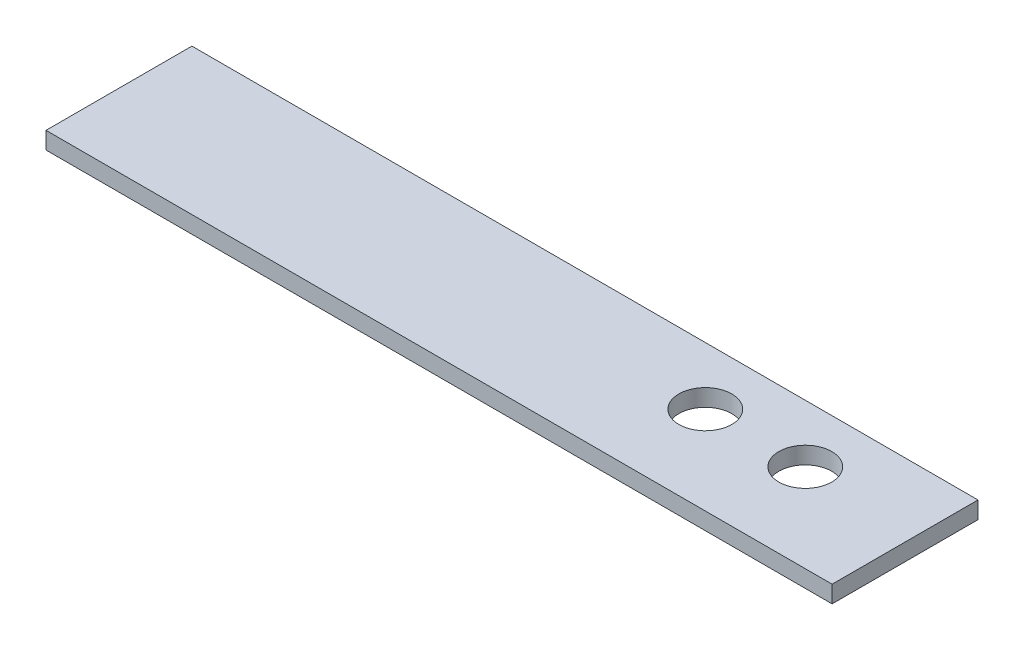
ISO-10303-21;
HEADER;
FILE_DESCRIPTION(('STEP AP214'),'2;1');
FILE_NAME('part.step','',(''),(''),'','','');
FILE_SCHEMA(('AUTOMOTIVE_DESIGN { 1 0 10303 214 1 1 1 1 }'));
ENDSEC;
DATA;
#1=APPLICATION_CONTEXT('core data for automotive mechanical design processes');
#2=APPLICATION_PROTOCOL_DEFINITION('international standard','automotive_design',2000,#1);
#3=PRODUCT_CONTEXT('',#1,'mechanical');
#4=PRODUCT('Part','Part','',(#3));
#5=PRODUCT_RELATED_PRODUCT_CATEGORY('part','',(#4));
#6=PRODUCT_DEFINITION_FORMATION('','',#4);
#7=PRODUCT_DEFINITION_CONTEXT('part definition',#1,'design');
#8=PRODUCT_DEFINITION('design','',#6,#7);
#9=PRODUCT_DEFINITION_SHAPE('','',#8);
#10=(LENGTH_UNIT() NAMED_UNIT(*) SI_UNIT(.MILLI.,.METRE.));
#11=(NAMED_UNIT(*) PLANE_ANGLE_UNIT() SI_UNIT($,.RADIAN.));
#12=(NAMED_UNIT(*) SI_UNIT($,.STERADIAN.) SOLID_ANGLE_UNIT());
#13=UNCERTAINTY_MEASURE_WITH_UNIT(LENGTH_MEASURE(1.E-05),#10,'distance_accuracy_value','');
#14=(GEOMETRIC_REPRESENTATION_CONTEXT(3) GLOBAL_UNCERTAINTY_ASSIGNED_CONTEXT((#13)) GLOBAL_UNIT_ASSIGNED_CONTEXT((#10,
#11,#12)) REPRESENTATION_CONTEXT('',''));
#15=CARTESIAN_POINT('',(0.,0.,0.));
#16=DIRECTION('',(0.,0.,1.));
#17=DIRECTION('',(1.,0.,0.));
#18=AXIS2_PLACEMENT_3D('',#15,#16,#17);
#19=CARTESIAN_POINT('',(-62.800543040071,19.05,15.8181818935517));
#20=DIRECTION('',(0.,0.,-1.));
#21=DIRECTION('',(-1.,0.,0.));
#22=AXIS2_PLACEMENT_3D('',#19,#20,#21);
#23=PLANE('',#22);
#24=DIRECTION('',(1.,0.,0.));
#25=VECTOR('',#24,1.);
#26=CARTESIAN_POINT('',(-62.800543040071,0.,15.8181818935517));
#27=LINE('',#26,#25);
#28=CARTESIAN_POINT('',(-62.800543040071,0.,15.8181818935517));
#29=VERTEX_POINT('',#28);
#30=CARTESIAN_POINT('',(813.499456959929,0.,15.8181818935517));
#31=VERTEX_POINT('',#30);
#32=EDGE_CURVE('E106',#29,#31,#27,.T.);
#33=ORIENTED_EDGE('',*,*,#32,.T.);
#34=DIRECTION('',(0.,-1.,0.));
#35=VECTOR('',#34,1.);
#36=CARTESIAN_POINT('',(813.499456959929,19.05,15.8181818935517));
#37=LINE('',#36,#35);
#38=CARTESIAN_POINT('',(813.499456959929,19.05,15.8181818935517));
#39=VERTEX_POINT('',#38);
#40=EDGE_CURVE('E11',#39,#31,#37,.T.);
#41=ORIENTED_EDGE('',*,*,#40,.F.);
#42=DIRECTION('',(1.,0.,0.));
#43=VECTOR('',#42,1.);
#44=CARTESIAN_POINT('',(-62.800543040071,19.05,15.8181818935517));
#45=LINE('',#44,#43);
#46=CARTESIAN_POINT('',(-62.800543040071,19.05,15.8181818935517));
#47=VERTEX_POINT('',#46);
#48=EDGE_CURVE('E79',#47,#39,#45,.T.);
#49=ORIENTED_EDGE('',*,*,#48,.F.);
#50=DIRECTION('',(0.,-1.,0.));
#51=VECTOR('',#50,1.);
#52=CARTESIAN_POINT('',(-62.800543040071,19.05,15.8181818935517));
#53=LINE('',#52,#51);
#54=EDGE_CURVE('E102',#47,#29,#53,.T.);
#55=ORIENTED_EDGE('',*,*,#54,.T.);
#56=EDGE_LOOP('',(#33,#41,#49,#55));
#57=FACE_BOUND('',#56,.T.);
#58=ADVANCED_FACE('F39',(#57),#23,.F.);
#59=CARTESIAN_POINT('',(813.499456959929,19.05,-146.821173802448));
#60=DIRECTION('',(1.,0.,0.));
#61=DIRECTION('',(0.,0.,-1.));
#62=AXIS2_PLACEMENT_3D('',#59,#60,#61);
#63=PLANE('',#62);
#64=DIRECTION('',(0.,0.,1.));
#65=VECTOR('',#64,1.);
#66=CARTESIAN_POINT('',(813.499456959929,0.,-146.821173802448));
#67=LINE('',#66,#65);
#68=CARTESIAN_POINT('',(813.499456959929,0.,-146.821173802448));
#69=VERTEX_POINT('',#68);
#70=EDGE_CURVE('E88',#69,#31,#67,.T.);
#71=ORIENTED_EDGE('',*,*,#70,.F.);
#72=DIRECTION('',(0.,-1.,0.));
#73=VECTOR('',#72,1.);
#74=CARTESIAN_POINT('',(813.499456959929,19.05,-146.821173802448));
#75=LINE('',#74,#73);
#76=CARTESIAN_POINT('',(813.499456959929,19.05,-146.821173802448));
#77=VERTEX_POINT('',#76);
#78=EDGE_CURVE('E48',#77,#69,#75,.T.);
#79=ORIENTED_EDGE('',*,*,#78,.F.);
#80=DIRECTION('',(0.,0.,1.));
#81=VECTOR('',#80,1.);
#82=CARTESIAN_POINT('',(813.499456959929,19.05,-146.821173802448));
#83=LINE('',#82,#81);
#84=EDGE_CURVE('E86',#77,#39,#83,.T.);
#85=ORIENTED_EDGE('',*,*,#84,.T.);
#86=ORIENTED_EDGE('',*,*,#40,.T.);
#87=EDGE_LOOP('',(#71,#79,#85,#86));
#88=FACE_BOUND('',#87,.T.);
#89=ADVANCED_FACE('F85',(#88),#63,.T.);
#90=CARTESIAN_POINT('',(-62.800543040071,19.05,-146.821173802448));
#91=DIRECTION('',(0.,0.,-1.));
#92=DIRECTION('',(-1.,0.,0.));
#93=AXIS2_PLACEMENT_3D('',#90,#91,#92);
#94=PLANE('',#93);
#95=DIRECTION('',(1.,0.,0.));
#96=VECTOR('',#95,1.);
#97=CARTESIAN_POINT('',(-62.800543040071,0.,-146.821173802448));
#98=LINE('',#97,#96);
#99=CARTESIAN_POINT('',(-62.800543040071,0.,-146.821173802448));
#100=VERTEX_POINT('',#99);
#101=EDGE_CURVE('E113',#100,#69,#98,.T.);
#102=ORIENTED_EDGE('',*,*,#101,.F.);
#103=DIRECTION('',(0.,-1.,0.));
#104=VECTOR('',#103,1.);
#105=CARTESIAN_POINT('',(-62.800543040071,19.05,-146.821173802448));
#106=LINE('',#105,#104);
#107=CARTESIAN_POINT('',(-62.800543040071,19.05,-146.821173802448));
#108=VERTEX_POINT('',#107);
#109=EDGE_CURVE('E71',#108,#100,#106,.T.);
#110=ORIENTED_EDGE('',*,*,#109,.F.);
#111=DIRECTION('',(1.,0.,0.));
#112=VECTOR('',#111,1.);
#113=CARTESIAN_POINT('',(-62.800543040071,19.05,-146.821173802448));
#114=LINE('',#113,#112);
#115=EDGE_CURVE('E95',#108,#77,#114,.T.);
#116=ORIENTED_EDGE('',*,*,#115,.T.);
#117=ORIENTED_EDGE('',*,*,#78,.T.);
#118=EDGE_LOOP('',(#102,#110,#116,#117));
#119=FACE_BOUND('',#118,.T.);
#120=ADVANCED_FACE('F98',(#119),#94,.T.);
#121=CARTESIAN_POINT('',(-62.800543040071,19.05,-146.821173802448));
#122=DIRECTION('',(1.,0.,0.));
#123=DIRECTION('',(0.,0.,-1.));
#124=AXIS2_PLACEMENT_3D('',#121,#122,#123);
#125=PLANE('',#124);
#126=DIRECTION('',(0.,0.,1.));
#127=VECTOR('',#126,1.);
#128=CARTESIAN_POINT('',(-62.800543040071,0.,-146.821173802448));
#129=LINE('',#128,#127);
#130=EDGE_CURVE('E74',#100,#29,#129,.T.);
#131=ORIENTED_EDGE('',*,*,#130,.T.);
#132=ORIENTED_EDGE('',*,*,#54,.F.);
#133=DIRECTION('',(0.,0.,1.));
#134=VECTOR('',#133,1.);
#135=CARTESIAN_POINT('',(-62.800543040071,19.05,-146.821173802448));
#136=LINE('',#135,#134);
#137=EDGE_CURVE('E56',#108,#47,#136,.T.);
#138=ORIENTED_EDGE('',*,*,#137,.F.);
#139=ORIENTED_EDGE('',*,*,#109,.T.);
#140=EDGE_LOOP('',(#131,#132,#138,#139));
#141=FACE_BOUND('',#140,.T.);
#142=ADVANCED_FACE('F136',(#141),#125,.F.);
#143=CARTESIAN_POINT('',(0.,19.05,0.));
#144=DIRECTION('',(0.,-1.,0.));
#145=DIRECTION('',(0.,0.,-1.));
#146=AXIS2_PLACEMENT_3D('',#143,#144,#145);
#147=PLANE('',#146);
#148=CARTESIAN_POINT('',(685.24027425031,19.05,-82.5679467617447));
#149=DIRECTION('',(0.,1.,0.));
#150=DIRECTION('',(0.,0.,1.));
#151=AXIS2_PLACEMENT_3D('',#148,#149,#150);
#152=CIRCLE('',#151,29.499999928);
#153=CARTESIAN_POINT('',(685.24027425031,19.05,-53.0679468337446));
#154=VERTEX_POINT('',#153);
#155=EDGE_CURVE('E187',#154,#154,#152,.T.);
#156=ORIENTED_EDGE('',*,*,#155,.F.);
#157=EDGE_LOOP('',(#156));
#158=FACE_BOUND('',#157,.T.);
#159=CARTESIAN_POINT('',(573.905935057533,19.05,-82.4588113000032));
#160=DIRECTION('',(0.,1.,0.));
#161=DIRECTION('',(0.,0.,1.));
#162=AXIS2_PLACEMENT_3D('',#159,#160,#161);
#163=CIRCLE('',#162,29.4999999279999);
#164=CARTESIAN_POINT('',(573.905935057533,19.05,-52.9588113720032));
#165=VERTEX_POINT('',#164);
#166=EDGE_CURVE('E191',#165,#165,#163,.T.);
#167=ORIENTED_EDGE('',*,*,#166,.F.);
#168=EDGE_LOOP('',(#167));
#169=FACE_BOUND('',#168,.T.);
#170=ORIENTED_EDGE('',*,*,#48,.T.);
#171=ORIENTED_EDGE('',*,*,#84,.F.);
#172=ORIENTED_EDGE('',*,*,#115,.F.);
#173=ORIENTED_EDGE('',*,*,#137,.T.);
#174=EDGE_LOOP('',(#170,#171,#172,#173));
#175=FACE_BOUND('',#174,.T.);
#176=ADVANCED_FACE('F94',(#158,#169,#175),#147,.F.);
#177=CARTESIAN_POINT('',(0.,0.,0.));
#178=DIRECTION('',(0.,-1.,0.));
#179=DIRECTION('',(0.,0.,-1.));
#180=AXIS2_PLACEMENT_3D('',#177,#178,#179);
#181=PLANE('',#180);
#182=CARTESIAN_POINT('',(685.24027425031,0.,-82.5679467617447));
#183=DIRECTION('',(0.,1.,0.));
#184=DIRECTION('',(0.,0.,1.));
#185=AXIS2_PLACEMENT_3D('',#182,#183,#184);
#186=CIRCLE('',#185,29.499999928);
#187=CARTESIAN_POINT('',(685.24027425031,0.,-53.0679468337446));
#188=VERTEX_POINT('',#187);
#189=EDGE_CURVE('E184',#188,#188,#186,.T.);
#190=ORIENTED_EDGE('',*,*,#189,.T.);
#191=EDGE_LOOP('',(#190));
#192=FACE_BOUND('',#191,.T.);
#193=CARTESIAN_POINT('',(573.905935057533,0.,-82.4588113000032));
#194=DIRECTION('',(0.,1.,0.));
#195=DIRECTION('',(0.,0.,1.));
#196=AXIS2_PLACEMENT_3D('',#193,#194,#195);
#197=CIRCLE('',#196,29.4999999279999);
#198=CARTESIAN_POINT('',(573.905935057533,0.,-52.9588113720032));
#199=VERTEX_POINT('',#198);
#200=EDGE_CURVE('E110',#199,#199,#197,.T.);
#201=ORIENTED_EDGE('',*,*,#200,.T.);
#202=EDGE_LOOP('',(#201));
#203=FACE_BOUND('',#202,.T.);
#204=ORIENTED_EDGE('',*,*,#32,.F.);
#205=ORIENTED_EDGE('',*,*,#130,.F.);
#206=ORIENTED_EDGE('',*,*,#101,.T.);
#207=ORIENTED_EDGE('',*,*,#70,.T.);
#208=EDGE_LOOP('',(#204,#205,#206,#207));
#209=FACE_BOUND('',#208,.T.);
#210=ADVANCED_FACE('F124',(#192,#203,#209),#181,.T.);
#211=CARTESIAN_POINT('',(573.905935057533,0.,-82.4588113000032));
#212=DIRECTION('',(0.,1.,0.));
#213=DIRECTION('',(0.,0.,1.));
#214=AXIS2_PLACEMENT_3D('',#211,#212,#213);
#215=CYLINDRICAL_SURFACE('',#214,29.4999999279999);
#216=CARTESIAN_POINT('',(573.905935057533,0.,-52.9588113720032));
#217=CARTESIAN_POINT('',(573.905935057533,0.1984375,-52.9588113720032));
#218=CARTESIAN_POINT('',(573.905935057533,0.396875,-52.9588113720032));
#219=CARTESIAN_POINT('',(573.905935057533,0.79375,-52.9588113720032));
#220=CARTESIAN_POINT('',(573.905935057533,0.9921875,-52.9588113720032));
#221=CARTESIAN_POINT('',(573.905935057533,1.3890625,-52.9588113720032));
#222=CARTESIAN_POINT('',(573.905935057533,1.5875,-52.9588113720032));
#223=CARTESIAN_POINT('',(573.905935057533,1.984375,-52.9588113720032));
#224=CARTESIAN_POINT('',(573.905935057533,2.1828125,-52.9588113720032));
#225=CARTESIAN_POINT('',(573.905935057533,2.5796875,-52.9588113720032));
#226=CARTESIAN_POINT('',(573.905935057533,2.778125,-52.9588113720032));
#227=CARTESIAN_POINT('',(573.905935057533,3.175,-52.9588113720032));
#228=CARTESIAN_POINT('',(573.905935057533,3.3734375,-52.9588113720032));
#229=CARTESIAN_POINT('',(573.905935057533,3.7703125,-52.9588113720032));
#230=CARTESIAN_POINT('',(573.905935057533,3.96875,-52.9588113720032));
#231=CARTESIAN_POINT('',(573.905935057533,4.365625,-52.9588113720032));
#232=CARTESIAN_POINT('',(573.905935057533,4.5640625,-52.9588113720032));
#233=CARTESIAN_POINT('',(573.905935057533,4.9609375,-52.9588113720032));
#234=CARTESIAN_POINT('',(573.905935057533,5.159375,-52.9588113720032));
#235=CARTESIAN_POINT('',(573.905935057533,5.55625,-52.9588113720032));
#236=CARTESIAN_POINT('',(573.905935057533,5.7546875,-52.9588113720032));
#237=CARTESIAN_POINT('',(573.905935057533,6.1515625,-52.9588113720032));
#238=CARTESIAN_POINT('',(573.905935057533,6.35,-52.9588113720032));
#239=CARTESIAN_POINT('',(573.905935057533,6.746875,-52.9588113720032));
#240=CARTESIAN_POINT('',(573.905935057533,6.9453125,-52.9588113720032));
#241=CARTESIAN_POINT('',(573.905935057533,7.3421875,-52.9588113720032));
#242=CARTESIAN_POINT('',(573.905935057533,7.540625,-52.9588113720032));
#243=CARTESIAN_POINT('',(573.905935057533,7.9375,-52.9588113720032));
#244=CARTESIAN_POINT('',(573.905935057533,8.1359375,-52.9588113720032));
#245=CARTESIAN_POINT('',(573.905935057533,8.5328125,-52.9588113720032));
#246=CARTESIAN_POINT('',(573.905935057533,8.73125,-52.9588113720032));
#247=CARTESIAN_POINT('',(573.905935057533,9.128125,-52.9588113720032));
#248=CARTESIAN_POINT('',(573.905935057533,9.3265625,-52.9588113720032));
#249=CARTESIAN_POINT('',(573.905935057533,9.7234375,-52.9588113720032));
#250=CARTESIAN_POINT('',(573.905935057533,9.921875,-52.9588113720032));
#251=CARTESIAN_POINT('',(573.905935057533,10.31875,-52.9588113720032));
#252=CARTESIAN_POINT('',(573.905935057533,10.5171875,-52.9588113720032));
#253=CARTESIAN_POINT('',(573.905935057533,10.9140625,-52.9588113720032));
#254=CARTESIAN_POINT('',(573.905935057533,11.1125,-52.9588113720032));
#255=CARTESIAN_POINT('',(573.905935057533,11.509375,-52.9588113720032));
#256=CARTESIAN_POINT('',(573.905935057533,11.7078125,-52.9588113720032));
#257=CARTESIAN_POINT('',(573.905935057533,12.1046875,-52.9588113720032));
#258=CARTESIAN_POINT('',(573.905935057533,12.303125,-52.9588113720032));
#259=CARTESIAN_POINT('',(573.905935057533,12.7,-52.9588113720032));
#260=CARTESIAN_POINT('',(573.905935057533,12.8984375,-52.9588113720032));
#261=CARTESIAN_POINT('',(573.905935057533,13.2953125,-52.9588113720032));
#262=CARTESIAN_POINT('',(573.905935057533,13.49375,-52.9588113720032));
#263=CARTESIAN_POINT('',(573.905935057533,13.890625,-52.9588113720032));
#264=CARTESIAN_POINT('',(573.905935057533,14.0890625,-52.9588113720032));
#265=CARTESIAN_POINT('',(573.905935057533,14.4859375,-52.9588113720032));
#266=CARTESIAN_POINT('',(573.905935057533,14.684375,-52.9588113720032));
#267=CARTESIAN_POINT('',(573.905935057533,15.08125,-52.9588113720032));
#268=CARTESIAN_POINT('',(573.905935057533,15.2796875,-52.9588113720032));
#269=CARTESIAN_POINT('',(573.905935057533,15.6765625,-52.9588113720032));
#270=CARTESIAN_POINT('',(573.905935057533,15.875,-52.9588113720032));
#271=CARTESIAN_POINT('',(573.905935057533,16.271875,-52.9588113720032));
#272=CARTESIAN_POINT('',(573.905935057533,16.4703125,-52.9588113720032));
#273=CARTESIAN_POINT('',(573.905935057533,16.8671875,-52.9588113720032));
#274=CARTESIAN_POINT('',(573.905935057533,17.065625,-52.9588113720032));
#275=CARTESIAN_POINT('',(573.905935057533,17.4625,-52.9588113720032));
#276=CARTESIAN_POINT('',(573.905935057533,17.6609375,-52.9588113720032));
#277=CARTESIAN_POINT('',(573.905935057533,18.0578125,-52.9588113720032));
#278=CARTESIAN_POINT('',(573.905935057533,18.25625,-52.9588113720032));
#279=CARTESIAN_POINT('',(573.905935057533,18.653125,-52.9588113720032));
#280=CARTESIAN_POINT('',(573.905935057533,18.8515625,-52.9588113720032));
#281=CARTESIAN_POINT('',(573.905935057533,19.05,-52.9588113720032));
#282=B_SPLINE_CURVE_WITH_KNOTS('',3,(#216,#217,#218,#219,#220,#221,#222,#223,#224,#225,#226,
#227,#228,#229,#230,#231,#232,#233,#234,#235,#236,#237,#238,#239,#240,#241,#242,#243,#244,#245,
#246,#247,#248,#249,#250,#251,#252,#253,#254,#255,#256,#257,#258,#259,#260,#261,#262,#263,#264,
#265,#266,#267,#268,#269,#270,#271,#272,#273,#274,#275,#276,#277,#278,#279,#280,#281),
.UNSPECIFIED.,.F.,.F.,(4,2,2,2,2,2,2,2,2,2,2,2,2,2,2,2,2,2,2,2,2,2,2,2,2,2,2,2,2,2,2,2,4),(0.,
0.5953125,1.190625,1.7859375,2.38125,2.9765625,3.571875,4.1671875,4.7625,5.3578125,5.953125,
6.5484375,7.14375,7.7390625,8.334375,8.9296875,9.525,10.1203125,10.715625,11.3109375,11.90625,
12.5015625,13.096875,13.6921875,14.2875,14.8828125,15.478125,16.0734375,16.66875,17.2640625,
17.859375,18.4546875,19.05),.UNSPECIFIED.);
#283=EDGE_CURVE('BSEAM126',#199,#165,#282,.T.);
#284=ORIENTED_EDGE('',*,*,#200,.F.);
#285=ORIENTED_EDGE('',*,*,#166,.T.);
#286=ORIENTED_EDGE('',*,*,#283,.T.);
#287=ORIENTED_EDGE('',*,*,#283,.F.);
#288=EDGE_LOOP('',(#284,#286,#285,#287));
#289=FACE_BOUND('',#288,.T.);
#290=ADVANCED_FACE('F126',(#289),#215,.F.);
#291=CARTESIAN_POINT('',(685.24027425031,0.,-82.5679467617447));
#292=DIRECTION('',(0.,1.,0.));
#293=DIRECTION('',(0.,0.,1.));
#294=AXIS2_PLACEMENT_3D('',#291,#292,#293);
#295=CYLINDRICAL_SURFACE('',#294,29.499999928);
#296=CARTESIAN_POINT('',(685.24027425031,0.,-53.0679468337446));
#297=CARTESIAN_POINT('',(685.24027425031,0.1984375,-53.0679468337446));
#298=CARTESIAN_POINT('',(685.24027425031,0.396875,-53.0679468337446));
#299=CARTESIAN_POINT('',(685.24027425031,0.79375,-53.0679468337446));
#300=CARTESIAN_POINT('',(685.24027425031,0.9921875,-53.0679468337446));
#301=CARTESIAN_POINT('',(685.24027425031,1.3890625,-53.0679468337446));
#302=CARTESIAN_POINT('',(685.24027425031,1.5875,-53.0679468337446));
#303=CARTESIAN_POINT('',(685.24027425031,1.984375,-53.0679468337446));
#304=CARTESIAN_POINT('',(685.24027425031,2.1828125,-53.0679468337446));
#305=CARTESIAN_POINT('',(685.24027425031,2.5796875,-53.0679468337446));
#306=CARTESIAN_POINT('',(685.24027425031,2.778125,-53.0679468337446));
#307=CARTESIAN_POINT('',(685.24027425031,3.175,-53.0679468337446));
#308=CARTESIAN_POINT('',(685.24027425031,3.3734375,-53.0679468337446));
#309=CARTESIAN_POINT('',(685.24027425031,3.7703125,-53.0679468337446));
#310=CARTESIAN_POINT('',(685.24027425031,3.96875,-53.0679468337446));
#311=CARTESIAN_POINT('',(685.24027425031,4.365625,-53.0679468337446));
#312=CARTESIAN_POINT('',(685.24027425031,4.5640625,-53.0679468337446));
#313=CARTESIAN_POINT('',(685.24027425031,4.9609375,-53.0679468337446));
#314=CARTESIAN_POINT('',(685.24027425031,5.159375,-53.0679468337446));
#315=CARTESIAN_POINT('',(685.24027425031,5.55625,-53.0679468337446));
#316=CARTESIAN_POINT('',(685.24027425031,5.7546875,-53.0679468337446));
#317=CARTESIAN_POINT('',(685.24027425031,6.1515625,-53.0679468337446));
#318=CARTESIAN_POINT('',(685.24027425031,6.35,-53.0679468337446));
#319=CARTESIAN_POINT('',(685.24027425031,6.746875,-53.0679468337446));
#320=CARTESIAN_POINT('',(685.24027425031,6.9453125,-53.0679468337446));
#321=CARTESIAN_POINT('',(685.24027425031,7.3421875,-53.0679468337446));
#322=CARTESIAN_POINT('',(685.24027425031,7.540625,-53.0679468337446));
#323=CARTESIAN_POINT('',(685.24027425031,7.9375,-53.0679468337446));
#324=CARTESIAN_POINT('',(685.24027425031,8.1359375,-53.0679468337446));
#325=CARTESIAN_POINT('',(685.24027425031,8.5328125,-53.0679468337446));
#326=CARTESIAN_POINT('',(685.24027425031,8.73125,-53.0679468337446));
#327=CARTESIAN_POINT('',(685.24027425031,9.128125,-53.0679468337446));
#328=CARTESIAN_POINT('',(685.24027425031,9.3265625,-53.0679468337446));
#329=CARTESIAN_POINT('',(685.24027425031,9.7234375,-53.0679468337446));
#330=CARTESIAN_POINT('',(685.24027425031,9.921875,-53.0679468337446));
#331=CARTESIAN_POINT('',(685.24027425031,10.31875,-53.0679468337446));
#332=CARTESIAN_POINT('',(685.24027425031,10.5171875,-53.0679468337446));
#333=CARTESIAN_POINT('',(685.24027425031,10.9140625,-53.0679468337446));
#334=CARTESIAN_POINT('',(685.24027425031,11.1125,-53.0679468337446));
#335=CARTESIAN_POINT('',(685.24027425031,11.509375,-53.0679468337446));
#336=CARTESIAN_POINT('',(685.24027425031,11.7078125,-53.0679468337446));
#337=CARTESIAN_POINT('',(685.24027425031,12.1046875,-53.0679468337446));
#338=CARTESIAN_POINT('',(685.24027425031,12.303125,-53.0679468337446));
#339=CARTESIAN_POINT('',(685.24027425031,12.7,-53.0679468337446));
#340=CARTESIAN_POINT('',(685.24027425031,12.8984375,-53.0679468337446));
#341=CARTESIAN_POINT('',(685.24027425031,13.2953125,-53.0679468337446));
#342=CARTESIAN_POINT('',(685.24027425031,13.49375,-53.0679468337446));
#343=CARTESIAN_POINT('',(685.24027425031,13.890625,-53.0679468337446));
#344=CARTESIAN_POINT('',(685.24027425031,14.0890625,-53.0679468337446));
#345=CARTESIAN_POINT('',(685.24027425031,14.4859375,-53.0679468337446));
#346=CARTESIAN_POINT('',(685.24027425031,14.684375,-53.0679468337446));
#347=CARTESIAN_POINT('',(685.24027425031,15.08125,-53.0679468337446));
#348=CARTESIAN_POINT('',(685.24027425031,15.2796875,-53.0679468337446));
#349=CARTESIAN_POINT('',(685.24027425031,15.6765625,-53.0679468337446));
#350=CARTESIAN_POINT('',(685.24027425031,15.875,-53.0679468337446));
#351=CARTESIAN_POINT('',(685.24027425031,16.271875,-53.0679468337446));
#352=CARTESIAN_POINT('',(685.24027425031,16.4703125,-53.0679468337446));
#353=CARTESIAN_POINT('',(685.24027425031,16.8671875,-53.0679468337446));
#354=CARTESIAN_POINT('',(685.24027425031,17.065625,-53.0679468337446));
#355=CARTESIAN_POINT('',(685.24027425031,17.4625,-53.0679468337446));
#356=CARTESIAN_POINT('',(685.24027425031,17.6609375,-53.0679468337446));
#357=CARTESIAN_POINT('',(685.24027425031,18.0578125,-53.0679468337446));
#358=CARTESIAN_POINT('',(685.24027425031,18.25625,-53.0679468337446));
#359=CARTESIAN_POINT('',(685.24027425031,18.653125,-53.0679468337446));
#360=CARTESIAN_POINT('',(685.24027425031,18.8515625,-53.0679468337446));
#361=CARTESIAN_POINT('',(685.24027425031,19.05,-53.0679468337446));
#362=B_SPLINE_CURVE_WITH_KNOTS('',3,(#296,#297,#298,#299,#300,#301,#302,#303,#304,#305,#306,
#307,#308,#309,#310,#311,#312,#313,#314,#315,#316,#317,#318,#319,#320,#321,#322,#323,#324,#325,
#326,#327,#328,#329,#330,#331,#332,#333,#334,#335,#336,#337,#338,#339,#340,#341,#342,#343,#344,
#345,#346,#347,#348,#349,#350,#351,#352,#353,#354,#355,#356,#357,#358,#359,#360,#361),
.UNSPECIFIED.,.F.,.F.,(4,2,2,2,2,2,2,2,2,2,2,2,2,2,2,2,2,2,2,2,2,2,2,2,2,2,2,2,2,2,2,2,4),(0.,
0.5953125,1.190625,1.7859375,2.38125,2.9765625,3.571875,4.1671875,4.7625,5.3578125,5.953125,
6.5484375,7.14375,7.7390625,8.334375,8.9296875,9.525,10.1203125,10.715625,11.3109375,11.90625,
12.5015625,13.096875,13.6921875,14.2875,14.8828125,15.478125,16.0734375,16.66875,17.2640625,
17.859375,18.4546875,19.05),.UNSPECIFIED.);
#363=EDGE_CURVE('BSEAM133',#188,#154,#362,.T.);
#364=ORIENTED_EDGE('',*,*,#189,.F.);
#365=ORIENTED_EDGE('',*,*,#155,.T.);
#366=ORIENTED_EDGE('',*,*,#363,.T.);
#367=ORIENTED_EDGE('',*,*,#363,.F.);
#368=EDGE_LOOP('',(#364,#366,#365,#367));
#369=FACE_BOUND('',#368,.T.);
#370=ADVANCED_FACE('F133',(#369),#295,.F.);
#371=CLOSED_SHELL('',(#58,#89,#120,#142,#176,#210,#290,#370));
#372=MANIFOLD_SOLID_BREP('B2',#371);
#373=ADVANCED_BREP_SHAPE_REPRESENTATION('',(#18,#372),#14);
#374=SHAPE_DEFINITION_REPRESENTATION(#9,#373);
ENDSEC;
END-ISO-10303-21;
